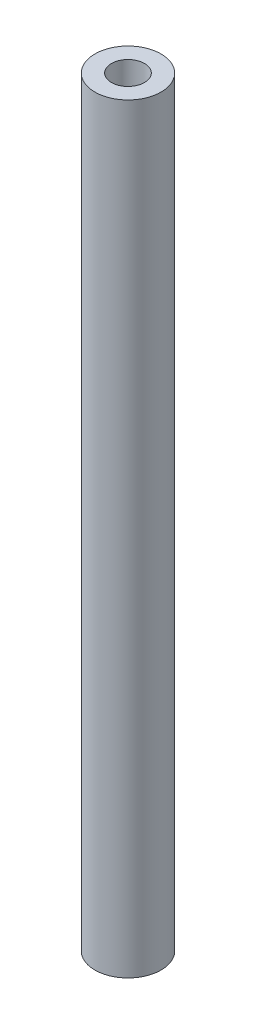
ISO-10303-21;
HEADER;
FILE_DESCRIPTION(('STEP AP214'),'2;1');
FILE_NAME('part.step','',(''),(''),'','','');
FILE_SCHEMA(('AUTOMOTIVE_DESIGN { 1 0 10303 214 1 1 1 1 }'));
ENDSEC;
DATA;
#1=APPLICATION_CONTEXT('core data for automotive mechanical design processes');
#2=APPLICATION_PROTOCOL_DEFINITION('international standard','automotive_design',2000,#1);
#3=PRODUCT_CONTEXT('',#1,'mechanical');
#4=PRODUCT('Part','Part','',(#3));
#5=PRODUCT_RELATED_PRODUCT_CATEGORY('part','',(#4));
#6=PRODUCT_DEFINITION_FORMATION('','',#4);
#7=PRODUCT_DEFINITION_CONTEXT('part definition',#1,'design');
#8=PRODUCT_DEFINITION('design','',#6,#7);
#9=PRODUCT_DEFINITION_SHAPE('','',#8);
#10=(LENGTH_UNIT() NAMED_UNIT(*) SI_UNIT(.MILLI.,.METRE.));
#11=(NAMED_UNIT(*) PLANE_ANGLE_UNIT() SI_UNIT($,.RADIAN.));
#12=(NAMED_UNIT(*) SI_UNIT($,.STERADIAN.) SOLID_ANGLE_UNIT());
#13=UNCERTAINTY_MEASURE_WITH_UNIT(LENGTH_MEASURE(1.E-05),#10,'distance_accuracy_value','');
#14=(GEOMETRIC_REPRESENTATION_CONTEXT(3) GLOBAL_UNCERTAINTY_ASSIGNED_CONTEXT((#13)) GLOBAL_UNIT_ASSIGNED_CONTEXT((#10,
#11,#12)) REPRESENTATION_CONTEXT('',''));
#15=CARTESIAN_POINT('',(0.,0.,0.));
#16=DIRECTION('',(0.,0.,1.));
#17=DIRECTION('',(1.,0.,0.));
#18=AXIS2_PLACEMENT_3D('',#15,#16,#17);
#19=CARTESIAN_POINT('',(-0.951287670134509,115.,2.46214322013451));
#20=DIRECTION('',(0.,1.,0.));
#21=DIRECTION('',(0.,0.,1.));
#22=AXIS2_PLACEMENT_3D('',#19,#20,#21);
#23=PLANE('',#22);
#24=CARTESIAN_POINT('',(-0.951287670134509,115.,2.46214322013451));
#25=DIRECTION('',(0.,1.,0.));
#26=DIRECTION('',(0.,0.,1.));
#27=AXIS2_PLACEMENT_3D('',#24,#25,#26);
#28=CIRCLE('',#27,5.);
#29=CARTESIAN_POINT('',(-0.951287670134509,115.,7.46214322013451));
#30=VERTEX_POINT('',#29);
#31=EDGE_CURVE('E10',#30,#30,#28,.T.);
#32=ORIENTED_EDGE('',*,*,#31,.T.);
#33=EDGE_LOOP('',(#32));
#34=FACE_BOUND('',#33,.T.);
#35=CARTESIAN_POINT('',(-0.951287670134509,115.,2.46214322013451));
#36=DIRECTION('',(0.,1.,0.));
#37=DIRECTION('',(0.,0.,1.));
#38=AXIS2_PLACEMENT_3D('',#35,#36,#37);
#39=CIRCLE('',#38,2.5);
#40=CARTESIAN_POINT('',(-0.951287670134509,115.,4.96214322013451));
#41=VERTEX_POINT('',#40);
#42=EDGE_CURVE('E42',#41,#41,#39,.T.);
#43=ORIENTED_EDGE('',*,*,#42,.F.);
#44=EDGE_LOOP('',(#43));
#45=FACE_BOUND('',#44,.T.);
#46=ADVANCED_FACE('F31',(#34,#45),#23,.T.);
#47=CARTESIAN_POINT('',(-0.951287670134509,0.,2.46214322013451));
#48=DIRECTION('',(0.,1.,0.));
#49=DIRECTION('',(0.,0.,1.));
#50=AXIS2_PLACEMENT_3D('',#47,#48,#49);
#51=PLANE('',#50);
#52=CARTESIAN_POINT('',(-0.951287670134509,0.,2.46214322013451));
#53=DIRECTION('',(0.,1.,0.));
#54=DIRECTION('',(0.,0.,1.));
#55=AXIS2_PLACEMENT_3D('',#52,#53,#54);
#56=CIRCLE('',#55,5.);
#57=CARTESIAN_POINT('',(-0.951287670134509,0.,7.46214322013451));
#58=VERTEX_POINT('',#57);
#59=EDGE_CURVE('E35',#58,#58,#56,.T.);
#60=ORIENTED_EDGE('',*,*,#59,.F.);
#61=EDGE_LOOP('',(#60));
#62=FACE_BOUND('',#61,.T.);
#63=CARTESIAN_POINT('',(-0.951287670134509,0.,2.46214322013451));
#64=DIRECTION('',(0.,1.,0.));
#65=DIRECTION('',(0.,0.,1.));
#66=AXIS2_PLACEMENT_3D('',#63,#64,#65);
#67=CIRCLE('',#66,2.5);
#68=CARTESIAN_POINT('',(-0.951287670134509,0.,4.96214322013451));
#69=VERTEX_POINT('',#68);
#70=EDGE_CURVE('E44',#69,#69,#67,.T.);
#71=ORIENTED_EDGE('',*,*,#70,.T.);
#72=EDGE_LOOP('',(#71));
#73=FACE_BOUND('',#72,.T.);
#74=ADVANCED_FACE('F54',(#62,#73),#51,.F.);
#75=CARTESIAN_POINT('',(-0.951287670134509,115.,2.46214322013451));
#76=DIRECTION('',(0.,-1.,0.));
#77=DIRECTION('',(0.,0.,-1.));
#78=AXIS2_PLACEMENT_3D('',#75,#76,#77);
#79=CYLINDRICAL_SURFACE('',#78,5.);
#80=ORIENTED_EDGE('',*,*,#31,.F.);
#81=EDGE_LOOP('',(#80));
#82=FACE_BOUND('',#81,.T.);
#83=ORIENTED_EDGE('',*,*,#59,.T.);
#84=EDGE_LOOP('',(#83));
#85=FACE_BOUND('',#84,.T.);
#86=ADVANCED_FACE('F33',(#82,#85),#79,.T.);
#87=CARTESIAN_POINT('',(-0.951287670134509,115.,2.46214322013451));
#88=DIRECTION('',(0.,-1.,0.));
#89=DIRECTION('',(0.,0.,-1.));
#90=AXIS2_PLACEMENT_3D('',#87,#88,#89);
#91=CYLINDRICAL_SURFACE('',#90,2.5);
#92=ORIENTED_EDGE('',*,*,#42,.T.);
#93=EDGE_LOOP('',(#92));
#94=FACE_BOUND('',#93,.T.);
#95=ORIENTED_EDGE('',*,*,#70,.F.);
#96=EDGE_LOOP('',(#95));
#97=FACE_BOUND('',#96,.T.);
#98=ADVANCED_FACE('F50',(#94,#97),#91,.F.);
#99=CLOSED_SHELL('',(#46,#74,#86,#98));
#100=MANIFOLD_SOLID_BREP('B2',#99);
#101=ADVANCED_BREP_SHAPE_REPRESENTATION('',(#18,#100),#14);
#102=SHAPE_DEFINITION_REPRESENTATION(#9,#101);
ENDSEC;
END-ISO-10303-21;
